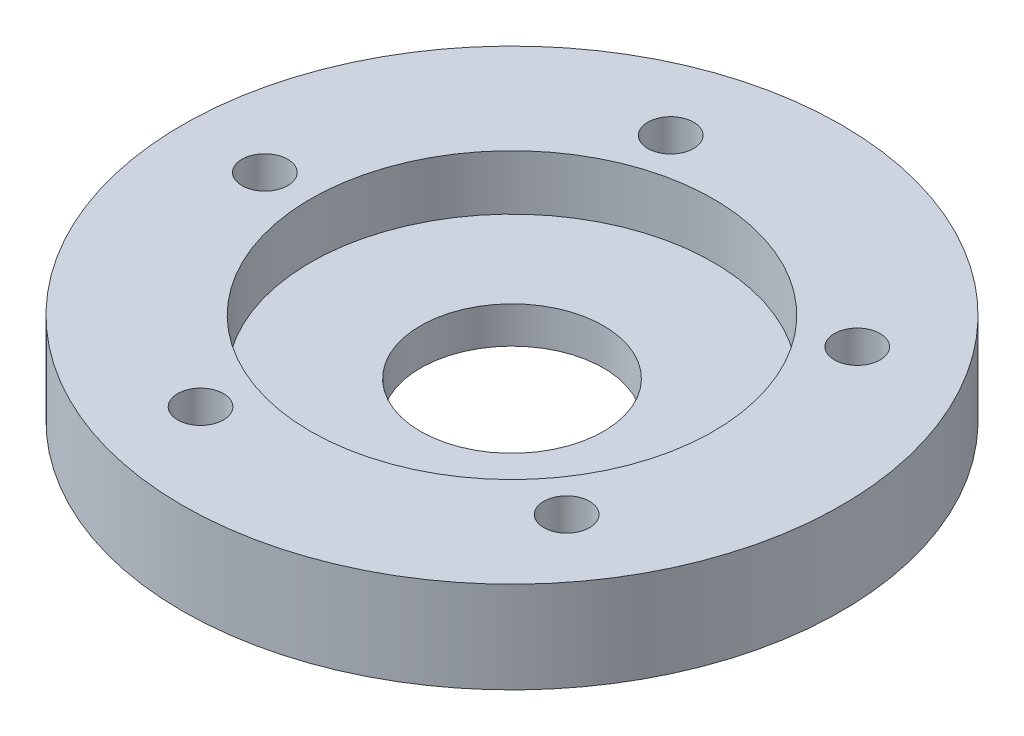
ISO-10303-21;
HEADER;
FILE_DESCRIPTION(('STEP AP214'),'2;1');
FILE_NAME('part.step','',(''),(''),'','','');
FILE_SCHEMA(('AUTOMOTIVE_DESIGN { 1 0 10303 214 1 1 1 1 }'));
ENDSEC;
DATA;
#1=APPLICATION_CONTEXT('core data for automotive mechanical design processes');
#2=APPLICATION_PROTOCOL_DEFINITION('international standard','automotive_design',2000,#1);
#3=PRODUCT_CONTEXT('',#1,'mechanical');
#4=PRODUCT('Part','Part','',(#3));
#5=PRODUCT_RELATED_PRODUCT_CATEGORY('part','',(#4));
#6=PRODUCT_DEFINITION_FORMATION('','',#4);
#7=PRODUCT_DEFINITION_CONTEXT('part definition',#1,'design');
#8=PRODUCT_DEFINITION('design','',#6,#7);
#9=PRODUCT_DEFINITION_SHAPE('','',#8);
#10=(LENGTH_UNIT() NAMED_UNIT(*) SI_UNIT(.MILLI.,.METRE.));
#11=(NAMED_UNIT(*) PLANE_ANGLE_UNIT() SI_UNIT($,.RADIAN.));
#12=(NAMED_UNIT(*) SI_UNIT($,.STERADIAN.) SOLID_ANGLE_UNIT());
#13=UNCERTAINTY_MEASURE_WITH_UNIT(LENGTH_MEASURE(1.E-05),#10,'distance_accuracy_value','');
#14=(GEOMETRIC_REPRESENTATION_CONTEXT(3) GLOBAL_UNCERTAINTY_ASSIGNED_CONTEXT((#13)) GLOBAL_UNIT_ASSIGNED_CONTEXT((#10,
#11,#12)) REPRESENTATION_CONTEXT('',''));
#15=CARTESIAN_POINT('',(0.,0.,0.));
#16=DIRECTION('',(0.,0.,1.));
#17=DIRECTION('',(1.,0.,0.));
#18=AXIS2_PLACEMENT_3D('',#15,#16,#17);
#19=CARTESIAN_POINT('',(10.9217294240618,-3.,7.93510090594839));
#20=DIRECTION('',(0.,1.,0.));
#21=DIRECTION('',(0.,0.,1.));
#22=AXIS2_PLACEMENT_3D('',#19,#20,#21);
#23=CYLINDRICAL_SURFACE('',#22,1.25);
#24=CARTESIAN_POINT('',(10.9217294240618,-3.,7.93510090594839));
#25=DIRECTION('',(0.,1.,0.));
#26=DIRECTION('',(0.,0.,1.));
#27=AXIS2_PLACEMENT_3D('',#24,#25,#26);
#28=CIRCLE('',#27,1.25);
#29=CARTESIAN_POINT('',(10.9217294240618,-3.,9.18510090594839));
#30=VERTEX_POINT('',#29);
#31=EDGE_CURVE('E10',#30,#30,#28,.T.);
#32=ORIENTED_EDGE('',*,*,#31,.F.);
#33=EDGE_LOOP('',(#32));
#34=FACE_BOUND('',#33,.T.);
#35=CARTESIAN_POINT('',(10.9217294240618,2.,7.93510090594839));
#36=DIRECTION('',(0.,1.,0.));
#37=DIRECTION('',(0.,0.,1.));
#38=AXIS2_PLACEMENT_3D('',#35,#36,#37);
#39=CIRCLE('',#38,1.25);
#40=CARTESIAN_POINT('',(10.9217294240618,2.,9.18510090594839));
#41=VERTEX_POINT('',#40);
#42=EDGE_CURVE('E58',#41,#41,#39,.T.);
#43=ORIENTED_EDGE('',*,*,#42,.T.);
#44=EDGE_LOOP('',(#43));
#45=FACE_BOUND('',#44,.T.);
#46=ADVANCED_FACE('F35',(#34,#45),#23,.F.);
#47=CARTESIAN_POINT('',(10.9217294240618,-3.,-7.93510090594839));
#48=DIRECTION('',(0.,1.,0.));
#49=DIRECTION('',(0.,0.,1.));
#50=AXIS2_PLACEMENT_3D('',#47,#48,#49);
#51=CYLINDRICAL_SURFACE('',#50,1.25);
#52=CARTESIAN_POINT('',(10.9217294240618,-3.,-7.93510090594839));
#53=DIRECTION('',(0.,1.,0.));
#54=DIRECTION('',(0.,0.,1.));
#55=AXIS2_PLACEMENT_3D('',#52,#53,#54);
#56=CIRCLE('',#55,1.25);
#57=CARTESIAN_POINT('',(10.9217294240618,-3.,-6.68510090594839));
#58=VERTEX_POINT('',#57);
#59=EDGE_CURVE('E43',#58,#58,#56,.T.);
#60=ORIENTED_EDGE('',*,*,#59,.F.);
#61=EDGE_LOOP('',(#60));
#62=FACE_BOUND('',#61,.T.);
#63=CARTESIAN_POINT('',(10.9217294240618,2.,-7.93510090594839));
#64=DIRECTION('',(0.,1.,0.));
#65=DIRECTION('',(0.,0.,1.));
#66=AXIS2_PLACEMENT_3D('',#63,#64,#65);
#67=CIRCLE('',#66,1.25);
#68=CARTESIAN_POINT('',(10.9217294240618,2.,-6.68510090594839));
#69=VERTEX_POINT('',#68);
#70=EDGE_CURVE('E61',#69,#69,#67,.T.);
#71=ORIENTED_EDGE('',*,*,#70,.T.);
#72=EDGE_LOOP('',(#71));
#73=FACE_BOUND('',#72,.T.);
#74=ADVANCED_FACE('F110',(#62,#73),#51,.F.);
#75=CARTESIAN_POINT('',(-4.17172942406179,-3.,-12.8392629699846));
#76=DIRECTION('',(0.,1.,0.));
#77=DIRECTION('',(0.,0.,1.));
#78=AXIS2_PLACEMENT_3D('',#75,#76,#77);
#79=CYLINDRICAL_SURFACE('',#78,1.25);
#80=CARTESIAN_POINT('',(-4.17172942406179,-3.,-12.8392629699846));
#81=DIRECTION('',(0.,1.,0.));
#82=DIRECTION('',(0.,0.,1.));
#83=AXIS2_PLACEMENT_3D('',#80,#81,#82);
#84=CIRCLE('',#83,1.25);
#85=CARTESIAN_POINT('',(-4.17172942406179,-3.,-11.5892629699846));
#86=VERTEX_POINT('',#85);
#87=EDGE_CURVE('E47',#86,#86,#84,.T.);
#88=ORIENTED_EDGE('',*,*,#87,.F.);
#89=EDGE_LOOP('',(#88));
#90=FACE_BOUND('',#89,.T.);
#91=CARTESIAN_POINT('',(-4.17172942406179,2.,-12.8392629699846));
#92=DIRECTION('',(0.,1.,0.));
#93=DIRECTION('',(0.,0.,1.));
#94=AXIS2_PLACEMENT_3D('',#91,#92,#93);
#95=CIRCLE('',#94,1.25);
#96=CARTESIAN_POINT('',(-4.17172942406179,2.,-11.5892629699846));
#97=VERTEX_POINT('',#96);
#98=EDGE_CURVE('E64',#97,#97,#95,.T.);
#99=ORIENTED_EDGE('',*,*,#98,.T.);
#100=EDGE_LOOP('',(#99));
#101=FACE_BOUND('',#100,.T.);
#102=ADVANCED_FACE('F116',(#90,#101),#79,.F.);
#103=CARTESIAN_POINT('',(-13.5,-3.,0.));
#104=DIRECTION('',(0.,1.,0.));
#105=DIRECTION('',(0.,0.,1.));
#106=AXIS2_PLACEMENT_3D('',#103,#104,#105);
#107=CYLINDRICAL_SURFACE('',#106,1.25);
#108=CARTESIAN_POINT('',(-13.5,-3.,0.));
#109=DIRECTION('',(0.,1.,0.));
#110=DIRECTION('',(0.,0.,1.));
#111=AXIS2_PLACEMENT_3D('',#108,#109,#110);
#112=CIRCLE('',#111,1.25);
#113=CARTESIAN_POINT('',(-13.5,-3.,1.25));
#114=VERTEX_POINT('',#113);
#115=EDGE_CURVE('E52',#114,#114,#112,.T.);
#116=ORIENTED_EDGE('',*,*,#115,.F.);
#117=EDGE_LOOP('',(#116));
#118=FACE_BOUND('',#117,.T.);
#119=CARTESIAN_POINT('',(-13.5,2.,0.));
#120=DIRECTION('',(0.,1.,0.));
#121=DIRECTION('',(0.,0.,1.));
#122=AXIS2_PLACEMENT_3D('',#119,#120,#121);
#123=CIRCLE('',#122,1.25);
#124=CARTESIAN_POINT('',(-13.5,2.,1.25));
#125=VERTEX_POINT('',#124);
#126=EDGE_CURVE('E67',#125,#125,#123,.T.);
#127=ORIENTED_EDGE('',*,*,#126,.T.);
#128=EDGE_LOOP('',(#127));
#129=FACE_BOUND('',#128,.T.);
#130=ADVANCED_FACE('F125',(#118,#129),#107,.F.);
#131=CARTESIAN_POINT('',(-4.17172942406179,-3.,12.8392629699846));
#132=DIRECTION('',(0.,1.,0.));
#133=DIRECTION('',(0.,0.,1.));
#134=AXIS2_PLACEMENT_3D('',#131,#132,#133);
#135=CYLINDRICAL_SURFACE('',#134,1.25);
#136=CARTESIAN_POINT('',(-4.17172942406179,-3.,12.8392629699846));
#137=DIRECTION('',(0.,1.,0.));
#138=DIRECTION('',(0.,0.,1.));
#139=AXIS2_PLACEMENT_3D('',#136,#137,#138);
#140=CIRCLE('',#139,1.25);
#141=CARTESIAN_POINT('',(-4.17172942406179,-3.,14.0892629699846));
#142=VERTEX_POINT('',#141);
#143=EDGE_CURVE('E55',#142,#142,#140,.T.);
#144=ORIENTED_EDGE('',*,*,#143,.F.);
#145=EDGE_LOOP('',(#144));
#146=FACE_BOUND('',#145,.T.);
#147=CARTESIAN_POINT('',(-4.17172942406179,2.,12.8392629699846));
#148=DIRECTION('',(0.,1.,0.));
#149=DIRECTION('',(0.,0.,1.));
#150=AXIS2_PLACEMENT_3D('',#147,#148,#149);
#151=CIRCLE('',#150,1.25);
#152=CARTESIAN_POINT('',(-4.17172942406179,2.,14.0892629699846));
#153=VERTEX_POINT('',#152);
#154=EDGE_CURVE('E70',#153,#153,#151,.T.);
#155=ORIENTED_EDGE('',*,*,#154,.T.);
#156=EDGE_LOOP('',(#155));
#157=FACE_BOUND('',#156,.T.);
#158=ADVANCED_FACE('F37',(#146,#157),#135,.F.);
#159=CARTESIAN_POINT('',(0.,-3.,0.));
#160=DIRECTION('',(0.,1.,0.));
#161=DIRECTION('',(0.,0.,1.));
#162=AXIS2_PLACEMENT_3D('',#159,#160,#161);
#163=PLANE('',#162);
#164=CARTESIAN_POINT('',(0.,-3.,0.));
#165=DIRECTION('',(0.,1.,0.));
#166=DIRECTION('',(0.,0.,1.));
#167=AXIS2_PLACEMENT_3D('',#164,#165,#166);
#168=CIRCLE('',#167,5.);
#169=CARTESIAN_POINT('',(0.,-3.,5.));
#170=VERTEX_POINT('',#169);
#171=EDGE_CURVE('E82',#170,#170,#168,.T.);
#172=ORIENTED_EDGE('',*,*,#171,.T.);
#173=EDGE_LOOP('',(#172));
#174=FACE_BOUND('',#173,.T.);
#175=ORIENTED_EDGE('',*,*,#143,.T.);
#176=EDGE_LOOP('',(#175));
#177=FACE_BOUND('',#176,.T.);
#178=ORIENTED_EDGE('',*,*,#115,.T.);
#179=EDGE_LOOP('',(#178));
#180=FACE_BOUND('',#179,.T.);
#181=ORIENTED_EDGE('',*,*,#87,.T.);
#182=EDGE_LOOP('',(#181));
#183=FACE_BOUND('',#182,.T.);
#184=ORIENTED_EDGE('',*,*,#59,.T.);
#185=EDGE_LOOP('',(#184));
#186=FACE_BOUND('',#185,.T.);
#187=ORIENTED_EDGE('',*,*,#31,.T.);
#188=EDGE_LOOP('',(#187));
#189=FACE_BOUND('',#188,.T.);
#190=CARTESIAN_POINT('',(0.,-3.,0.));
#191=DIRECTION('',(0.,1.,0.));
#192=DIRECTION('',(0.,0.,1.));
#193=AXIS2_PLACEMENT_3D('',#190,#191,#192);
#194=CIRCLE('',#193,18.);
#195=CARTESIAN_POINT('',(0.,-3.,18.));
#196=VERTEX_POINT('',#195);
#197=EDGE_CURVE('E73',#196,#196,#194,.T.);
#198=ORIENTED_EDGE('',*,*,#197,.F.);
#199=EDGE_LOOP('',(#198));
#200=FACE_BOUND('',#199,.T.);
#201=ADVANCED_FACE('F121',(#174,#177,#180,#183,#186,#189,#200),#163,.F.);
#202=CARTESIAN_POINT('',(0.,2.,0.));
#203=DIRECTION('',(0.,1.,0.));
#204=DIRECTION('',(0.,0.,1.));
#205=AXIS2_PLACEMENT_3D('',#202,#203,#204);
#206=PLANE('',#205);
#207=CARTESIAN_POINT('',(0.,2.,0.));
#208=DIRECTION('',(0.,1.,0.));
#209=DIRECTION('',(0.,0.,1.));
#210=AXIS2_PLACEMENT_3D('',#207,#208,#209);
#211=CIRCLE('',#210,11.);
#212=CARTESIAN_POINT('',(0.,2.,11.));
#213=VERTEX_POINT('',#212);
#214=EDGE_CURVE('E39',#213,#213,#211,.F.);
#215=ORIENTED_EDGE('',*,*,#214,.T.);
#216=EDGE_LOOP('',(#215));
#217=FACE_BOUND('',#216,.T.);
#218=ORIENTED_EDGE('',*,*,#154,.F.);
#219=EDGE_LOOP('',(#218));
#220=FACE_BOUND('',#219,.T.);
#221=ORIENTED_EDGE('',*,*,#126,.F.);
#222=EDGE_LOOP('',(#221));
#223=FACE_BOUND('',#222,.T.);
#224=ORIENTED_EDGE('',*,*,#98,.F.);
#225=EDGE_LOOP('',(#224));
#226=FACE_BOUND('',#225,.T.);
#227=ORIENTED_EDGE('',*,*,#70,.F.);
#228=EDGE_LOOP('',(#227));
#229=FACE_BOUND('',#228,.T.);
#230=ORIENTED_EDGE('',*,*,#42,.F.);
#231=EDGE_LOOP('',(#230));
#232=FACE_BOUND('',#231,.T.);
#233=CARTESIAN_POINT('',(0.,2.,0.));
#234=DIRECTION('',(0.,1.,0.));
#235=DIRECTION('',(0.,0.,1.));
#236=AXIS2_PLACEMENT_3D('',#233,#234,#235);
#237=CIRCLE('',#236,18.);
#238=CARTESIAN_POINT('',(0.,2.,18.));
#239=VERTEX_POINT('',#238);
#240=EDGE_CURVE('E74',#239,#239,#237,.T.);
#241=ORIENTED_EDGE('',*,*,#240,.T.);
#242=EDGE_LOOP('',(#241));
#243=FACE_BOUND('',#242,.T.);
#244=ADVANCED_FACE('F137',(#217,#220,#223,#226,#229,#232,#243),#206,.T.);
#245=CARTESIAN_POINT('',(0.,-3.,0.));
#246=DIRECTION('',(0.,1.,0.));
#247=DIRECTION('',(0.,0.,1.));
#248=AXIS2_PLACEMENT_3D('',#245,#246,#247);
#249=CYLINDRICAL_SURFACE('',#248,18.);
#250=ORIENTED_EDGE('',*,*,#197,.T.);
#251=EDGE_LOOP('',(#250));
#252=FACE_BOUND('',#251,.T.);
#253=ORIENTED_EDGE('',*,*,#240,.F.);
#254=EDGE_LOOP('',(#253));
#255=FACE_BOUND('',#254,.T.);
#256=ADVANCED_FACE('F96',(#252,#255),#249,.T.);
#257=CARTESIAN_POINT('',(0.,-1.,0.));
#258=DIRECTION('',(0.,1.,0.));
#259=DIRECTION('',(0.,0.,1.));
#260=AXIS2_PLACEMENT_3D('',#257,#258,#259);
#261=PLANE('',#260);
#262=CARTESIAN_POINT('',(0.,-1.,0.));
#263=DIRECTION('',(0.,1.,0.));
#264=DIRECTION('',(0.,0.,1.));
#265=AXIS2_PLACEMENT_3D('',#262,#263,#264);
#266=CIRCLE('',#265,5.);
#267=CARTESIAN_POINT('',(0.,-1.,5.));
#268=VERTEX_POINT('',#267);
#269=EDGE_CURVE('E85',#268,#268,#266,.T.);
#270=ORIENTED_EDGE('',*,*,#269,.F.);
#271=EDGE_LOOP('',(#270));
#272=FACE_BOUND('',#271,.T.);
#273=CARTESIAN_POINT('',(0.,-1.,0.));
#274=DIRECTION('',(0.,1.,0.));
#275=DIRECTION('',(0.,0.,1.));
#276=AXIS2_PLACEMENT_3D('',#273,#274,#275);
#277=CIRCLE('',#276,11.);
#278=CARTESIAN_POINT('',(0.,-1.,11.));
#279=VERTEX_POINT('',#278);
#280=EDGE_CURVE('E79',#279,#279,#277,.T.);
#281=ORIENTED_EDGE('',*,*,#280,.T.);
#282=EDGE_LOOP('',(#281));
#283=FACE_BOUND('',#282,.T.);
#284=ADVANCED_FACE('F92',(#272,#283),#261,.T.);
#285=CARTESIAN_POINT('',(0.,12.,0.));
#286=DIRECTION('',(0.,-1.,0.));
#287=DIRECTION('',(0.,0.,-1.));
#288=AXIS2_PLACEMENT_3D('',#285,#286,#287);
#289=CYLINDRICAL_SURFACE('',#288,11.);
#290=ORIENTED_EDGE('',*,*,#214,.F.);
#291=EDGE_LOOP('',(#290));
#292=FACE_BOUND('',#291,.T.);
#293=ORIENTED_EDGE('',*,*,#280,.F.);
#294=EDGE_LOOP('',(#293));
#295=FACE_BOUND('',#294,.T.);
#296=ADVANCED_FACE('F95',(#292,#295),#289,.F.);
#297=CARTESIAN_POINT('',(0.,-4.,0.));
#298=DIRECTION('',(0.,1.,0.));
#299=DIRECTION('',(0.,0.,1.));
#300=AXIS2_PLACEMENT_3D('',#297,#298,#299);
#301=CYLINDRICAL_SURFACE('',#300,5.);
#302=ORIENTED_EDGE('',*,*,#269,.T.);
#303=EDGE_LOOP('',(#302));
#304=FACE_BOUND('',#303,.T.);
#305=ORIENTED_EDGE('',*,*,#171,.F.);
#306=EDGE_LOOP('',(#305));
#307=FACE_BOUND('',#306,.T.);
#308=ADVANCED_FACE('F89',(#304,#307),#301,.F.);
#309=CLOSED_SHELL('',(#46,#74,#102,#130,#158,#201,#244,#256,#284,#296,#308));
#310=MANIFOLD_SOLID_BREP('B2',#309);
#311=ADVANCED_BREP_SHAPE_REPRESENTATION('',(#18,#310),#14);
#312=SHAPE_DEFINITION_REPRESENTATION(#9,#311);
ENDSEC;
END-ISO-10303-21;
